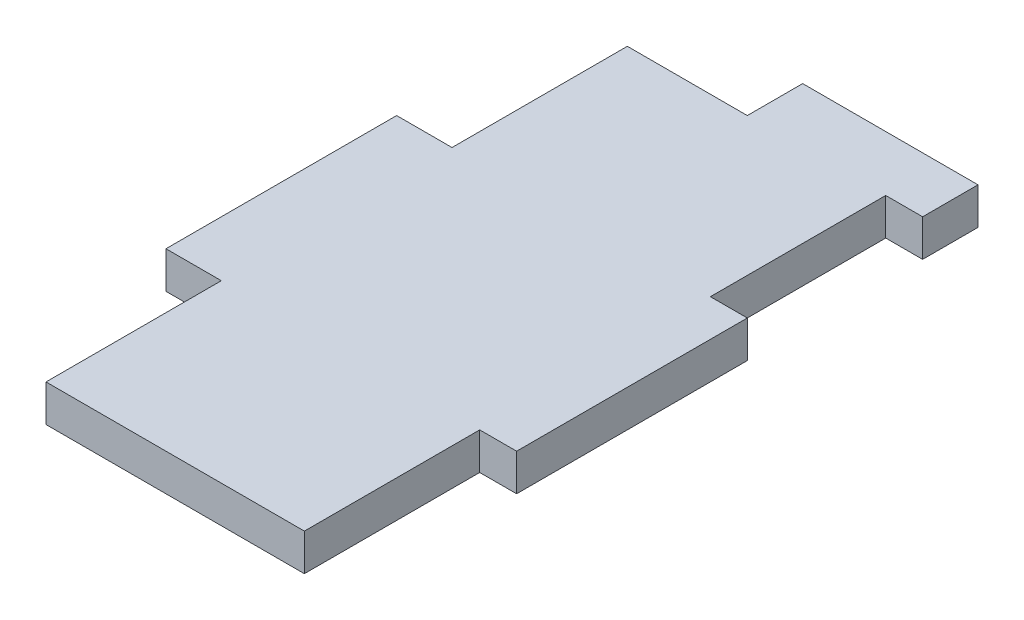
ISO-10303-21;
HEADER;
FILE_DESCRIPTION(('STEP AP214'),'2;1');
FILE_NAME('part.step','',(''),(''),'','','');
FILE_SCHEMA(('AUTOMOTIVE_DESIGN { 1 0 10303 214 1 1 1 1 }'));
ENDSEC;
DATA;
#1=APPLICATION_CONTEXT('core data for automotive mechanical design processes');
#2=APPLICATION_PROTOCOL_DEFINITION('international standard','automotive_design',2000,#1);
#3=PRODUCT_CONTEXT('',#1,'mechanical');
#4=PRODUCT('Part','Part','',(#3));
#5=PRODUCT_RELATED_PRODUCT_CATEGORY('part','',(#4));
#6=PRODUCT_DEFINITION_FORMATION('','',#4);
#7=PRODUCT_DEFINITION_CONTEXT('part definition',#1,'design');
#8=PRODUCT_DEFINITION('design','',#6,#7);
#9=PRODUCT_DEFINITION_SHAPE('','',#8);
#10=(LENGTH_UNIT() NAMED_UNIT(*) SI_UNIT(.MILLI.,.METRE.));
#11=(NAMED_UNIT(*) PLANE_ANGLE_UNIT() SI_UNIT($,.RADIAN.));
#12=(NAMED_UNIT(*) SI_UNIT($,.STERADIAN.) SOLID_ANGLE_UNIT());
#13=UNCERTAINTY_MEASURE_WITH_UNIT(LENGTH_MEASURE(1.E-05),#10,'distance_accuracy_value','');
#14=(GEOMETRIC_REPRESENTATION_CONTEXT(3) GLOBAL_UNCERTAINTY_ASSIGNED_CONTEXT((#13)) GLOBAL_UNIT_ASSIGNED_CONTEXT((#10,
#11,#12)) REPRESENTATION_CONTEXT('',''));
#15=CARTESIAN_POINT('',(0.,0.,0.));
#16=DIRECTION('',(0.,0.,1.));
#17=DIRECTION('',(1.,0.,0.));
#18=AXIS2_PLACEMENT_3D('',#15,#16,#17);
#19=CARTESIAN_POINT('',(0.,4.,0.));
#20=DIRECTION('',(1.,0.,0.));
#21=DIRECTION('',(0.,0.,-1.));
#22=AXIS2_PLACEMENT_3D('',#19,#20,#21);
#23=PLANE('',#22);
#24=DIRECTION('',(0.,1.,0.));
#25=VECTOR('',#24,1.);
#26=CARTESIAN_POINT('',(0.,0.,-25.));
#27=LINE('',#26,#25);
#28=CARTESIAN_POINT('',(0.,0.,-25.));
#29=VERTEX_POINT('',#28);
#30=CARTESIAN_POINT('',(0.,4.,-25.));
#31=VERTEX_POINT('',#30);
#32=EDGE_CURVE('E298',#29,#31,#27,.T.);
#33=ORIENTED_EDGE('',*,*,#32,.T.);
#34=DIRECTION('',(0.,0.,1.));
#35=VECTOR('',#34,1.);
#36=CARTESIAN_POINT('',(0.,4.,0.));
#37=LINE('',#36,#35);
#38=CARTESIAN_POINT('',(0.,4.,-50.));
#39=VERTEX_POINT('',#38);
#40=EDGE_CURVE('E207',#39,#31,#37,.T.);
#41=ORIENTED_EDGE('',*,*,#40,.F.);
#42=DIRECTION('',(0.,1.,0.));
#43=VECTOR('',#42,1.);
#44=CARTESIAN_POINT('',(0.,0.,-50.));
#45=LINE('',#44,#43);
#46=CARTESIAN_POINT('',(0.,0.,-50.));
#47=VERTEX_POINT('',#46);
#48=EDGE_CURVE('E321',#47,#39,#45,.T.);
#49=ORIENTED_EDGE('',*,*,#48,.F.);
#50=DIRECTION('',(0.,0.,1.));
#51=VECTOR('',#50,1.);
#52=CARTESIAN_POINT('',(0.,0.,0.));
#53=LINE('',#52,#51);
#54=EDGE_CURVE('E219',#47,#29,#53,.T.);
#55=ORIENTED_EDGE('',*,*,#54,.T.);
#56=EDGE_LOOP('',(#33,#41,#49,#55));
#57=FACE_BOUND('',#56,.T.);
#58=ADVANCED_FACE('F63',(#57),#23,.F.);
#59=CARTESIAN_POINT('',(38.,4.,0.));
#60=DIRECTION('',(-1.,0.,0.));
#61=DIRECTION('',(0.,0.,1.));
#62=AXIS2_PLACEMENT_3D('',#59,#60,#61);
#63=PLANE('',#62);
#64=DIRECTION('',(0.,1.,0.));
#65=VECTOR('',#64,1.);
#66=CARTESIAN_POINT('',(38.,0.,-25.));
#67=LINE('',#66,#65);
#68=CARTESIAN_POINT('',(38.,0.,-25.));
#69=VERTEX_POINT('',#68);
#70=CARTESIAN_POINT('',(38.,4.,-25.));
#71=VERTEX_POINT('',#70);
#72=EDGE_CURVE('E240',#69,#71,#67,.T.);
#73=ORIENTED_EDGE('',*,*,#72,.F.);
#74=DIRECTION('',(0.,0.,-1.));
#75=VECTOR('',#74,1.);
#76=CARTESIAN_POINT('',(38.,0.,0.));
#77=LINE('',#76,#75);
#78=CARTESIAN_POINT('',(38.,0.,-50.));
#79=VERTEX_POINT('',#78);
#80=EDGE_CURVE('E226',#69,#79,#77,.T.);
#81=ORIENTED_EDGE('',*,*,#80,.T.);
#82=DIRECTION('',(0.,1.,0.));
#83=VECTOR('',#82,1.);
#84=CARTESIAN_POINT('',(38.,0.,-50.));
#85=LINE('',#84,#83);
#86=CARTESIAN_POINT('',(38.,4.,-50.));
#87=VERTEX_POINT('',#86);
#88=EDGE_CURVE('E189',#79,#87,#85,.T.);
#89=ORIENTED_EDGE('',*,*,#88,.T.);
#90=DIRECTION('',(0.,0.,-1.));
#91=VECTOR('',#90,1.);
#92=CARTESIAN_POINT('',(38.,4.,0.));
#93=LINE('',#92,#91);
#94=EDGE_CURVE('E206',#71,#87,#93,.T.);
#95=ORIENTED_EDGE('',*,*,#94,.F.);
#96=EDGE_LOOP('',(#73,#81,#89,#95));
#97=FACE_BOUND('',#96,.T.);
#98=ADVANCED_FACE('F238',(#97),#63,.F.);
#99=DIRECTION('',(0.,1.,0.));
#100=VECTOR('',#99,1.);
#101=CARTESIAN_POINT('',(38.,0.,-69.));
#102=LINE('',#101,#100);
#103=CARTESIAN_POINT('',(38.,0.,-69.));
#104=VERTEX_POINT('',#103);
#105=CARTESIAN_POINT('',(38.,4.,-69.));
#106=VERTEX_POINT('',#105);
#107=EDGE_CURVE('E178',#104,#106,#102,.T.);
#108=ORIENTED_EDGE('',*,*,#107,.F.);
#109=CARTESIAN_POINT('',(38.,0.,-75.));
#110=VERTEX_POINT('',#109);
#111=EDGE_CURVE('E223',#104,#110,#77,.T.);
#112=ORIENTED_EDGE('',*,*,#111,.T.);
#113=DIRECTION('',(0.,-1.,0.));
#114=VECTOR('',#113,1.);
#115=CARTESIAN_POINT('',(38.,4.,-75.));
#116=LINE('',#115,#114);
#117=CARTESIAN_POINT('',(38.,4.,-75.));
#118=VERTEX_POINT('',#117);
#119=EDGE_CURVE('E12',#118,#110,#116,.T.);
#120=ORIENTED_EDGE('',*,*,#119,.F.);
#121=EDGE_CURVE('E196',#106,#118,#93,.T.);
#122=ORIENTED_EDGE('',*,*,#121,.F.);
#123=EDGE_LOOP('',(#108,#112,#120,#122));
#124=FACE_BOUND('',#123,.T.);
#125=ADVANCED_FACE('F203',(#124),#63,.F.);
#126=CARTESIAN_POINT('',(0.,4.,-75.));
#127=DIRECTION('',(0.,0.,1.));
#128=DIRECTION('',(1.,0.,0.));
#129=AXIS2_PLACEMENT_3D('',#126,#127,#128);
#130=PLANE('',#129);
#131=DIRECTION('',(0.,1.,0.));
#132=VECTOR('',#131,1.);
#133=CARTESIAN_POINT('',(19.,0.,-75.));
#134=LINE('',#133,#132);
#135=CARTESIAN_POINT('',(19.,0.,-75.));
#136=VERTEX_POINT('',#135);
#137=CARTESIAN_POINT('',(19.,4.,-75.));
#138=VERTEX_POINT('',#137);
#139=EDGE_CURVE('E326',#136,#138,#134,.T.);
#140=ORIENTED_EDGE('',*,*,#139,.T.);
#141=DIRECTION('',(-1.,0.,0.));
#142=VECTOR('',#141,1.);
#143=CARTESIAN_POINT('',(0.,4.,-75.));
#144=LINE('',#143,#142);
#145=EDGE_CURVE('E71',#118,#138,#144,.T.);
#146=ORIENTED_EDGE('',*,*,#145,.F.);
#147=ORIENTED_EDGE('',*,*,#119,.T.);
#148=DIRECTION('',(-1.,0.,0.));
#149=VECTOR('',#148,1.);
#150=CARTESIAN_POINT('',(0.,0.,-75.));
#151=LINE('',#150,#149);
#152=EDGE_CURVE('E213',#110,#136,#151,.T.);
#153=ORIENTED_EDGE('',*,*,#152,.T.);
#154=EDGE_LOOP('',(#140,#146,#147,#153));
#155=FACE_BOUND('',#154,.T.);
#156=ADVANCED_FACE('F375',(#155),#130,.F.);
#157=CARTESIAN_POINT('',(0.,4.,0.));
#158=DIRECTION('',(0.,-1.,0.));
#159=DIRECTION('',(0.,0.,-1.));
#160=AXIS2_PLACEMENT_3D('',#157,#158,#159);
#161=PLANE('',#160);
#162=DIRECTION('',(1.,0.,0.));
#163=VECTOR('',#162,1.);
#164=CARTESIAN_POINT('',(0.,4.,-25.));
#165=LINE('',#164,#163);
#166=CARTESIAN_POINT('',(6.,4.,-25.));
#167=VERTEX_POINT('',#166);
#168=EDGE_CURVE('E302',#31,#167,#165,.T.);
#169=ORIENTED_EDGE('',*,*,#168,.T.);
#170=DIRECTION('',(0.,0.,-1.));
#171=VECTOR('',#170,1.);
#172=CARTESIAN_POINT('',(6.,4.,0.));
#173=LINE('',#172,#171);
#174=CARTESIAN_POINT('',(6.,4.,-6.));
#175=VERTEX_POINT('',#174);
#176=EDGE_CURVE('E278',#175,#167,#173,.T.);
#177=ORIENTED_EDGE('',*,*,#176,.F.);
#178=DIRECTION('',(1.,0.,0.));
#179=VECTOR('',#178,1.);
#180=CARTESIAN_POINT('',(0.,4.,-6.));
#181=LINE('',#180,#179);
#182=CARTESIAN_POINT('',(34.,4.,-6.));
#183=VERTEX_POINT('',#182);
#184=EDGE_CURVE('E190',#175,#183,#181,.T.);
#185=ORIENTED_EDGE('',*,*,#184,.T.);
#186=DIRECTION('',(0.,0.,1.));
#187=VECTOR('',#186,1.);
#188=CARTESIAN_POINT('',(34.,4.,0.));
#189=LINE('',#188,#187);
#190=CARTESIAN_POINT('',(34.,4.,-25.));
#191=VERTEX_POINT('',#190);
#192=EDGE_CURVE('E269',#191,#183,#189,.T.);
#193=ORIENTED_EDGE('',*,*,#192,.F.);
#194=DIRECTION('',(1.,0.,0.));
#195=VECTOR('',#194,1.);
#196=CARTESIAN_POINT('',(0.,4.,-25.));
#197=LINE('',#196,#195);
#198=EDGE_CURVE('E279',#191,#71,#197,.T.);
#199=ORIENTED_EDGE('',*,*,#198,.T.);
#200=ORIENTED_EDGE('',*,*,#94,.T.);
#201=DIRECTION('',(-1.,0.,0.));
#202=VECTOR('',#201,1.);
#203=CARTESIAN_POINT('',(0.,4.,-50.));
#204=LINE('',#203,#202);
#205=CARTESIAN_POINT('',(34.,4.,-50.));
#206=VERTEX_POINT('',#205);
#207=EDGE_CURVE('E262',#87,#206,#204,.T.);
#208=ORIENTED_EDGE('',*,*,#207,.T.);
#209=DIRECTION('',(0.,0.,1.));
#210=VECTOR('',#209,1.);
#211=CARTESIAN_POINT('',(34.,4.,0.));
#212=LINE('',#211,#210);
#213=CARTESIAN_POINT('',(34.,4.,-69.));
#214=VERTEX_POINT('',#213);
#215=EDGE_CURVE('E199',#214,#206,#212,.T.);
#216=ORIENTED_EDGE('',*,*,#215,.F.);
#217=DIRECTION('',(1.,0.,0.));
#218=VECTOR('',#217,1.);
#219=CARTESIAN_POINT('',(0.,4.,-69.));
#220=LINE('',#219,#218);
#221=EDGE_CURVE('E181',#214,#106,#220,.T.);
#222=ORIENTED_EDGE('',*,*,#221,.T.);
#223=ORIENTED_EDGE('',*,*,#121,.T.);
#224=ORIENTED_EDGE('',*,*,#145,.T.);
#225=DIRECTION('',(0.,0.,1.));
#226=VECTOR('',#225,1.);
#227=CARTESIAN_POINT('',(19.,4.,-75.));
#228=LINE('',#227,#226);
#229=CARTESIAN_POINT('',(19.,4.,-69.));
#230=VERTEX_POINT('',#229);
#231=EDGE_CURVE('E340',#138,#230,#228,.T.);
#232=ORIENTED_EDGE('',*,*,#231,.T.);
#233=DIRECTION('',(1.,0.,0.));
#234=VECTOR('',#233,1.);
#235=CARTESIAN_POINT('',(0.,4.,-69.));
#236=LINE('',#235,#234);
#237=CARTESIAN_POINT('',(6.,4.,-69.));
#238=VERTEX_POINT('',#237);
#239=EDGE_CURVE('E201',#238,#230,#236,.T.);
#240=ORIENTED_EDGE('',*,*,#239,.F.);
#241=DIRECTION('',(0.,0.,-1.));
#242=VECTOR('',#241,1.);
#243=CARTESIAN_POINT('',(6.,4.,-50.));
#244=LINE('',#243,#242);
#245=CARTESIAN_POINT('',(6.,4.,-50.));
#246=VERTEX_POINT('',#245);
#247=EDGE_CURVE('E322',#246,#238,#244,.T.);
#248=ORIENTED_EDGE('',*,*,#247,.F.);
#249=DIRECTION('',(1.,0.,0.));
#250=VECTOR('',#249,1.);
#251=CARTESIAN_POINT('',(0.,4.,-50.));
#252=LINE('',#251,#250);
#253=EDGE_CURVE('E317',#39,#246,#252,.T.);
#254=ORIENTED_EDGE('',*,*,#253,.F.);
#255=ORIENTED_EDGE('',*,*,#40,.T.);
#256=EDGE_LOOP('',(#169,#177,#185,#193,#199,#200,#208,#216,#222,#223,#224,#232,#240,#248,#254,#255));
#257=FACE_BOUND('',#256,.T.);
#258=ADVANCED_FACE('F194',(#257),#161,.F.);
#259=CARTESIAN_POINT('',(0.,0.,0.));
#260=DIRECTION('',(0.,-1.,0.));
#261=DIRECTION('',(0.,0.,-1.));
#262=AXIS2_PLACEMENT_3D('',#259,#260,#261);
#263=PLANE('',#262);
#264=DIRECTION('',(0.,0.,-1.));
#265=VECTOR('',#264,1.);
#266=CARTESIAN_POINT('',(6.,0.,0.));
#267=LINE('',#266,#265);
#268=CARTESIAN_POINT('',(6.,0.,-6.));
#269=VERTEX_POINT('',#268);
#270=CARTESIAN_POINT('',(6.,0.,-25.));
#271=VERTEX_POINT('',#270);
#272=EDGE_CURVE('E78',#269,#271,#267,.T.);
#273=ORIENTED_EDGE('',*,*,#272,.T.);
#274=DIRECTION('',(1.,0.,0.));
#275=VECTOR('',#274,1.);
#276=CARTESIAN_POINT('',(0.,0.,-25.));
#277=LINE('',#276,#275);
#278=EDGE_CURVE('E294',#29,#271,#277,.T.);
#279=ORIENTED_EDGE('',*,*,#278,.F.);
#280=ORIENTED_EDGE('',*,*,#54,.F.);
#281=DIRECTION('',(1.,0.,0.));
#282=VECTOR('',#281,1.);
#283=CARTESIAN_POINT('',(0.,0.,-50.));
#284=LINE('',#283,#282);
#285=CARTESIAN_POINT('',(6.,0.,-50.));
#286=VERTEX_POINT('',#285);
#287=EDGE_CURVE('E316',#47,#286,#284,.T.);
#288=ORIENTED_EDGE('',*,*,#287,.T.);
#289=DIRECTION('',(0.,0.,-1.));
#290=VECTOR('',#289,1.);
#291=CARTESIAN_POINT('',(6.,0.,-50.));
#292=LINE('',#291,#290);
#293=CARTESIAN_POINT('',(6.,0.,-69.));
#294=VERTEX_POINT('',#293);
#295=EDGE_CURVE('E312',#286,#294,#292,.T.);
#296=ORIENTED_EDGE('',*,*,#295,.T.);
#297=DIRECTION('',(1.,0.,0.));
#298=VECTOR('',#297,1.);
#299=CARTESIAN_POINT('',(0.,0.,-69.));
#300=LINE('',#299,#298);
#301=CARTESIAN_POINT('',(19.,0.,-69.));
#302=VERTEX_POINT('',#301);
#303=EDGE_CURVE('E335',#294,#302,#300,.T.);
#304=ORIENTED_EDGE('',*,*,#303,.T.);
#305=DIRECTION('',(0.,0.,1.));
#306=VECTOR('',#305,1.);
#307=CARTESIAN_POINT('',(19.,0.,-75.));
#308=LINE('',#307,#306);
#309=EDGE_CURVE('E339',#136,#302,#308,.T.);
#310=ORIENTED_EDGE('',*,*,#309,.F.);
#311=ORIENTED_EDGE('',*,*,#152,.F.);
#312=ORIENTED_EDGE('',*,*,#111,.F.);
#313=DIRECTION('',(1.,0.,0.));
#314=VECTOR('',#313,1.);
#315=CARTESIAN_POINT('',(0.,0.,-69.));
#316=LINE('',#315,#314);
#317=CARTESIAN_POINT('',(34.,0.,-69.));
#318=VERTEX_POINT('',#317);
#319=EDGE_CURVE('E184',#318,#104,#316,.T.);
#320=ORIENTED_EDGE('',*,*,#319,.F.);
#321=DIRECTION('',(0.,0.,1.));
#322=VECTOR('',#321,1.);
#323=CARTESIAN_POINT('',(34.,0.,0.));
#324=LINE('',#323,#322);
#325=CARTESIAN_POINT('',(34.,0.,-50.));
#326=VERTEX_POINT('',#325);
#327=EDGE_CURVE('E249',#318,#326,#324,.T.);
#328=ORIENTED_EDGE('',*,*,#327,.T.);
#329=DIRECTION('',(-1.,0.,0.));
#330=VECTOR('',#329,1.);
#331=CARTESIAN_POINT('',(0.,0.,-50.));
#332=LINE('',#331,#330);
#333=EDGE_CURVE('E248',#79,#326,#332,.T.);
#334=ORIENTED_EDGE('',*,*,#333,.F.);
#335=ORIENTED_EDGE('',*,*,#80,.F.);
#336=DIRECTION('',(1.,0.,0.));
#337=VECTOR('',#336,1.);
#338=CARTESIAN_POINT('',(0.,0.,-25.));
#339=LINE('',#338,#337);
#340=CARTESIAN_POINT('',(34.,0.,-25.));
#341=VERTEX_POINT('',#340);
#342=EDGE_CURVE('E246',#341,#69,#339,.T.);
#343=ORIENTED_EDGE('',*,*,#342,.F.);
#344=DIRECTION('',(0.,0.,1.));
#345=VECTOR('',#344,1.);
#346=CARTESIAN_POINT('',(34.,0.,0.));
#347=LINE('',#346,#345);
#348=CARTESIAN_POINT('',(34.,0.,-6.));
#349=VERTEX_POINT('',#348);
#350=EDGE_CURVE('E283',#341,#349,#347,.T.);
#351=ORIENTED_EDGE('',*,*,#350,.T.);
#352=DIRECTION('',(1.,0.,0.));
#353=VECTOR('',#352,1.);
#354=CARTESIAN_POINT('',(0.,0.,-6.));
#355=LINE('',#354,#353);
#356=EDGE_CURVE('E266',#269,#349,#355,.T.);
#357=ORIENTED_EDGE('',*,*,#356,.F.);
#358=EDGE_LOOP('',(#273,#279,#280,#288,#296,#304,#310,#311,#312,#320,#328,#334,#335,#343,#351,#357));
#359=FACE_BOUND('',#358,.T.);
#360=ADVANCED_FACE('F244',(#359),#263,.T.);
#361=CARTESIAN_POINT('',(6.,0.,-50.));
#362=DIRECTION('',(1.,0.,0.));
#363=DIRECTION('',(0.,0.,-1.));
#364=AXIS2_PLACEMENT_3D('',#361,#362,#363);
#365=PLANE('',#364);
#366=DIRECTION('',(0.,-1.,0.));
#367=VECTOR('',#366,1.);
#368=CARTESIAN_POINT('',(6.,0.,-69.));
#369=LINE('',#368,#367);
#370=EDGE_CURVE('E224',#238,#294,#369,.T.);
#371=ORIENTED_EDGE('',*,*,#370,.T.);
#372=ORIENTED_EDGE('',*,*,#295,.F.);
#373=DIRECTION('',(0.,1.,0.));
#374=VECTOR('',#373,1.);
#375=CARTESIAN_POINT('',(6.,0.,-50.));
#376=LINE('',#375,#374);
#377=EDGE_CURVE('E332',#286,#246,#376,.T.);
#378=ORIENTED_EDGE('',*,*,#377,.T.);
#379=ORIENTED_EDGE('',*,*,#247,.T.);
#380=EDGE_LOOP('',(#371,#372,#378,#379));
#381=FACE_BOUND('',#380,.T.);
#382=ADVANCED_FACE('F358',(#381),#365,.F.);
#383=CARTESIAN_POINT('',(0.,0.,-50.));
#384=DIRECTION('',(0.,0.,1.));
#385=DIRECTION('',(1.,0.,0.));
#386=AXIS2_PLACEMENT_3D('',#383,#384,#385);
#387=PLANE('',#386);
#388=ORIENTED_EDGE('',*,*,#253,.T.);
#389=ORIENTED_EDGE('',*,*,#377,.F.);
#390=ORIENTED_EDGE('',*,*,#287,.F.);
#391=ORIENTED_EDGE('',*,*,#48,.T.);
#392=EDGE_LOOP('',(#388,#389,#390,#391));
#393=FACE_BOUND('',#392,.T.);
#394=ADVANCED_FACE('F368',(#393),#387,.F.);
#395=CARTESIAN_POINT('',(19.,0.,-75.));
#396=DIRECTION('',(-1.,0.,0.));
#397=DIRECTION('',(0.,0.,1.));
#398=AXIS2_PLACEMENT_3D('',#395,#396,#397);
#399=PLANE('',#398);
#400=ORIENTED_EDGE('',*,*,#231,.F.);
#401=ORIENTED_EDGE('',*,*,#139,.F.);
#402=ORIENTED_EDGE('',*,*,#309,.T.);
#403=DIRECTION('',(0.,1.,0.));
#404=VECTOR('',#403,1.);
#405=CARTESIAN_POINT('',(19.,0.,-69.));
#406=LINE('',#405,#404);
#407=EDGE_CURVE('E344',#302,#230,#406,.T.);
#408=ORIENTED_EDGE('',*,*,#407,.T.);
#409=EDGE_LOOP('',(#400,#401,#402,#408));
#410=FACE_BOUND('',#409,.T.);
#411=ADVANCED_FACE('F374',(#410),#399,.T.);
#412=CARTESIAN_POINT('',(0.,0.,-69.));
#413=DIRECTION('',(0.,0.,1.));
#414=DIRECTION('',(1.,0.,0.));
#415=AXIS2_PLACEMENT_3D('',#412,#413,#414);
#416=PLANE('',#415);
#417=ORIENTED_EDGE('',*,*,#239,.T.);
#418=ORIENTED_EDGE('',*,*,#407,.F.);
#419=ORIENTED_EDGE('',*,*,#303,.F.);
#420=ORIENTED_EDGE('',*,*,#370,.F.);
#421=EDGE_LOOP('',(#417,#418,#419,#420));
#422=FACE_BOUND('',#421,.T.);
#423=ADVANCED_FACE('F362',(#422),#416,.F.);
#424=CARTESIAN_POINT('',(0.,0.,-69.));
#425=DIRECTION('',(0.,0.,1.));
#426=DIRECTION('',(1.,0.,0.));
#427=AXIS2_PLACEMENT_3D('',#424,#425,#426);
#428=PLANE('',#427);
#429=ORIENTED_EDGE('',*,*,#221,.F.);
#430=DIRECTION('',(0.,1.,0.));
#431=VECTOR('',#430,1.);
#432=CARTESIAN_POINT('',(34.,0.,-69.));
#433=LINE('',#432,#431);
#434=EDGE_CURVE('E252',#318,#214,#433,.T.);
#435=ORIENTED_EDGE('',*,*,#434,.F.);
#436=ORIENTED_EDGE('',*,*,#319,.T.);
#437=ORIENTED_EDGE('',*,*,#107,.T.);
#438=EDGE_LOOP('',(#429,#435,#436,#437));
#439=FACE_BOUND('',#438,.T.);
#440=ADVANCED_FACE('F180',(#439),#428,.T.);
#441=CARTESIAN_POINT('',(0.,0.,-50.));
#442=DIRECTION('',(0.,0.,-1.));
#443=DIRECTION('',(-1.,0.,0.));
#444=AXIS2_PLACEMENT_3D('',#441,#442,#443);
#445=PLANE('',#444);
#446=ORIENTED_EDGE('',*,*,#207,.F.);
#447=ORIENTED_EDGE('',*,*,#88,.F.);
#448=ORIENTED_EDGE('',*,*,#333,.T.);
#449=DIRECTION('',(0.,1.,0.));
#450=VECTOR('',#449,1.);
#451=CARTESIAN_POINT('',(34.,0.,-50.));
#452=LINE('',#451,#450);
#453=EDGE_CURVE('E86',#326,#206,#452,.T.);
#454=ORIENTED_EDGE('',*,*,#453,.T.);
#455=EDGE_LOOP('',(#446,#447,#448,#454));
#456=FACE_BOUND('',#455,.T.);
#457=ADVANCED_FACE('F453',(#456),#445,.T.);
#458=CARTESIAN_POINT('',(34.,0.,0.));
#459=DIRECTION('',(-1.,0.,0.));
#460=DIRECTION('',(0.,0.,1.));
#461=AXIS2_PLACEMENT_3D('',#458,#459,#460);
#462=PLANE('',#461);
#463=ORIENTED_EDGE('',*,*,#215,.T.);
#464=ORIENTED_EDGE('',*,*,#453,.F.);
#465=ORIENTED_EDGE('',*,*,#327,.F.);
#466=ORIENTED_EDGE('',*,*,#434,.T.);
#467=EDGE_LOOP('',(#463,#464,#465,#466));
#468=FACE_BOUND('',#467,.T.);
#469=ADVANCED_FACE('F463',(#468),#462,.F.);
#470=CARTESIAN_POINT('',(0.,0.,-25.));
#471=DIRECTION('',(0.,0.,1.));
#472=DIRECTION('',(1.,0.,0.));
#473=AXIS2_PLACEMENT_3D('',#470,#471,#472);
#474=PLANE('',#473);
#475=ORIENTED_EDGE('',*,*,#168,.F.);
#476=ORIENTED_EDGE('',*,*,#32,.F.);
#477=ORIENTED_EDGE('',*,*,#278,.T.);
#478=DIRECTION('',(0.,1.,0.));
#479=VECTOR('',#478,1.);
#480=CARTESIAN_POINT('',(6.,0.,-25.));
#481=LINE('',#480,#479);
#482=EDGE_CURVE('E295',#271,#167,#481,.T.);
#483=ORIENTED_EDGE('',*,*,#482,.T.);
#484=EDGE_LOOP('',(#475,#476,#477,#483));
#485=FACE_BOUND('',#484,.T.);
#486=ADVANCED_FACE('F472',(#485),#474,.T.);
#487=CARTESIAN_POINT('',(6.,0.,0.));
#488=DIRECTION('',(1.,0.,0.));
#489=DIRECTION('',(0.,0.,-1.));
#490=AXIS2_PLACEMENT_3D('',#487,#488,#489);
#491=PLANE('',#490);
#492=ORIENTED_EDGE('',*,*,#176,.T.);
#493=ORIENTED_EDGE('',*,*,#482,.F.);
#494=ORIENTED_EDGE('',*,*,#272,.F.);
#495=DIRECTION('',(0.,1.,0.));
#496=VECTOR('',#495,1.);
#497=CARTESIAN_POINT('',(6.,0.,-6.));
#498=LINE('',#497,#496);
#499=EDGE_CURVE('E291',#269,#175,#498,.T.);
#500=ORIENTED_EDGE('',*,*,#499,.T.);
#501=EDGE_LOOP('',(#492,#493,#494,#500));
#502=FACE_BOUND('',#501,.T.);
#503=ADVANCED_FACE('F482',(#502),#491,.F.);
#504=CARTESIAN_POINT('',(0.,0.,-25.));
#505=DIRECTION('',(0.,0.,1.));
#506=DIRECTION('',(1.,0.,0.));
#507=AXIS2_PLACEMENT_3D('',#504,#505,#506);
#508=PLANE('',#507);
#509=ORIENTED_EDGE('',*,*,#198,.F.);
#510=DIRECTION('',(0.,1.,0.));
#511=VECTOR('',#510,1.);
#512=CARTESIAN_POINT('',(34.,0.,-25.));
#513=LINE('',#512,#511);
#514=EDGE_CURVE('E275',#341,#191,#513,.T.);
#515=ORIENTED_EDGE('',*,*,#514,.F.);
#516=ORIENTED_EDGE('',*,*,#342,.T.);
#517=ORIENTED_EDGE('',*,*,#72,.T.);
#518=EDGE_LOOP('',(#509,#515,#516,#517));
#519=FACE_BOUND('',#518,.T.);
#520=ADVANCED_FACE('F492',(#519),#508,.T.);
#521=CARTESIAN_POINT('',(34.,0.,0.));
#522=DIRECTION('',(-1.,0.,0.));
#523=DIRECTION('',(0.,0.,1.));
#524=AXIS2_PLACEMENT_3D('',#521,#522,#523);
#525=PLANE('',#524);
#526=ORIENTED_EDGE('',*,*,#192,.T.);
#527=DIRECTION('',(0.,1.,0.));
#528=VECTOR('',#527,1.);
#529=CARTESIAN_POINT('',(34.,0.,-6.));
#530=LINE('',#529,#528);
#531=EDGE_CURVE('E270',#349,#183,#530,.T.);
#532=ORIENTED_EDGE('',*,*,#531,.F.);
#533=ORIENTED_EDGE('',*,*,#350,.F.);
#534=ORIENTED_EDGE('',*,*,#514,.T.);
#535=EDGE_LOOP('',(#526,#532,#533,#534));
#536=FACE_BOUND('',#535,.T.);
#537=ADVANCED_FACE('F503',(#536),#525,.F.);
#538=CARTESIAN_POINT('',(0.,0.,-6.));
#539=DIRECTION('',(0.,0.,1.));
#540=DIRECTION('',(1.,0.,0.));
#541=AXIS2_PLACEMENT_3D('',#538,#539,#540);
#542=PLANE('',#541);
#543=ORIENTED_EDGE('',*,*,#356,.T.);
#544=ORIENTED_EDGE('',*,*,#531,.T.);
#545=ORIENTED_EDGE('',*,*,#184,.F.);
#546=ORIENTED_EDGE('',*,*,#499,.F.);
#547=EDGE_LOOP('',(#543,#544,#545,#546));
#548=FACE_BOUND('',#547,.T.);
#549=ADVANCED_FACE('F494',(#548),#542,.T.);
#550=CLOSED_SHELL('',(#58,#98,#125,#156,#258,#360,#382,#394,#411,#423,#440,#457,#469,#486,#503,
#520,#537,#549));
#551=MANIFOLD_SOLID_BREP('B2',#550);
#552=ADVANCED_BREP_SHAPE_REPRESENTATION('',(#18,#551),#14);
#553=SHAPE_DEFINITION_REPRESENTATION(#9,#552);
ENDSEC;
END-ISO-10303-21;
